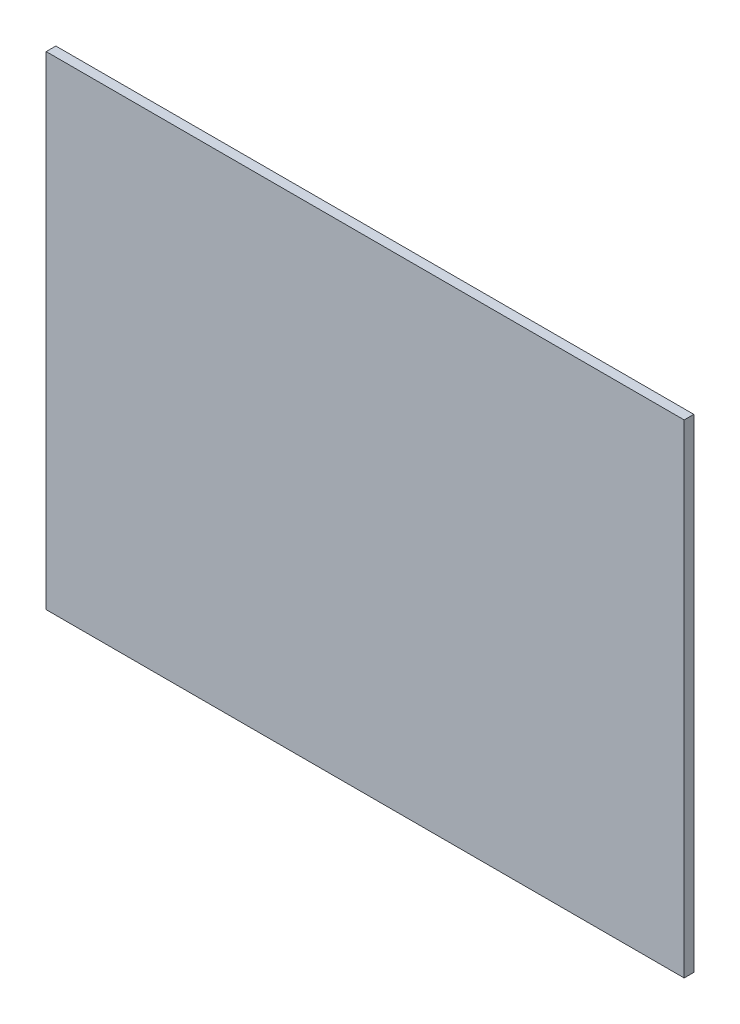
ISO-10303-21;
HEADER;
FILE_DESCRIPTION(('STEP AP214'),'2;1');
FILE_NAME('part.step','',(''),(''),'','','');
FILE_SCHEMA(('AUTOMOTIVE_DESIGN { 1 0 10303 214 1 1 1 1 }'));
ENDSEC;
DATA;
#1=APPLICATION_CONTEXT('core data for automotive mechanical design processes');
#2=APPLICATION_PROTOCOL_DEFINITION('international standard','automotive_design',2000,#1);
#3=PRODUCT_CONTEXT('',#1,'mechanical');
#4=PRODUCT('Part','Part','',(#3));
#5=PRODUCT_RELATED_PRODUCT_CATEGORY('part','',(#4));
#6=PRODUCT_DEFINITION_FORMATION('','',#4);
#7=PRODUCT_DEFINITION_CONTEXT('part definition',#1,'design');
#8=PRODUCT_DEFINITION('design','',#6,#7);
#9=PRODUCT_DEFINITION_SHAPE('','',#8);
#10=(LENGTH_UNIT() NAMED_UNIT(*) SI_UNIT(.MILLI.,.METRE.));
#11=(NAMED_UNIT(*) PLANE_ANGLE_UNIT() SI_UNIT($,.RADIAN.));
#12=(NAMED_UNIT(*) SI_UNIT($,.STERADIAN.) SOLID_ANGLE_UNIT());
#13=UNCERTAINTY_MEASURE_WITH_UNIT(LENGTH_MEASURE(1.E-05),#10,'distance_accuracy_value','');
#14=(GEOMETRIC_REPRESENTATION_CONTEXT(3) GLOBAL_UNCERTAINTY_ASSIGNED_CONTEXT((#13)) GLOBAL_UNIT_ASSIGNED_CONTEXT((#10,
#11,#12)) REPRESENTATION_CONTEXT('',''));
#15=CARTESIAN_POINT('',(0.,0.,0.));
#16=DIRECTION('',(0.,0.,1.));
#17=DIRECTION('',(1.,0.,0.));
#18=AXIS2_PLACEMENT_3D('',#15,#16,#17);
#19=CARTESIAN_POINT('',(-33.,25.,1.));
#20=DIRECTION('',(1.,0.,0.));
#21=DIRECTION('',(0.,1.,0.));
#22=AXIS2_PLACEMENT_3D('',#19,#20,#21);
#23=PLANE('',#22);
#24=DIRECTION('',(0.,-1.,0.));
#25=VECTOR('',#24,1.);
#26=CARTESIAN_POINT('',(-33.,25.,0.));
#27=LINE('',#26,#25);
#28=CARTESIAN_POINT('',(-33.,25.,0.));
#29=VERTEX_POINT('',#28);
#30=CARTESIAN_POINT('',(-33.,-25.,0.));
#31=VERTEX_POINT('',#30);
#32=EDGE_CURVE('E110',#29,#31,#27,.T.);
#33=ORIENTED_EDGE('',*,*,#32,.T.);
#34=DIRECTION('',(0.,0.,-1.));
#35=VECTOR('',#34,1.);
#36=CARTESIAN_POINT('',(-33.,-25.,1.));
#37=LINE('',#36,#35);
#38=CARTESIAN_POINT('',(-33.,-25.,1.));
#39=VERTEX_POINT('',#38);
#40=EDGE_CURVE('E11',#39,#31,#37,.T.);
#41=ORIENTED_EDGE('',*,*,#40,.F.);
#42=DIRECTION('',(0.,-1.,0.));
#43=VECTOR('',#42,1.);
#44=CARTESIAN_POINT('',(-33.,25.,1.));
#45=LINE('',#44,#43);
#46=CARTESIAN_POINT('',(-33.,25.,1.));
#47=VERTEX_POINT('',#46);
#48=EDGE_CURVE('E94',#47,#39,#45,.T.);
#49=ORIENTED_EDGE('',*,*,#48,.F.);
#50=DIRECTION('',(0.,0.,-1.));
#51=VECTOR('',#50,1.);
#52=CARTESIAN_POINT('',(-33.,25.,1.));
#53=LINE('',#52,#51);
#54=EDGE_CURVE('E106',#47,#29,#53,.T.);
#55=ORIENTED_EDGE('',*,*,#54,.T.);
#56=EDGE_LOOP('',(#33,#41,#49,#55));
#57=FACE_BOUND('',#56,.T.);
#58=ADVANCED_FACE('F42',(#57),#23,.F.);
#59=CARTESIAN_POINT('',(-33.,-25.,1.));
#60=DIRECTION('',(0.,1.,0.));
#61=DIRECTION('',(0.,0.,1.));
#62=AXIS2_PLACEMENT_3D('',#59,#60,#61);
#63=PLANE('',#62);
#64=DIRECTION('',(1.,0.,0.));
#65=VECTOR('',#64,1.);
#66=CARTESIAN_POINT('',(-33.,-25.,0.));
#67=LINE('',#66,#65);
#68=CARTESIAN_POINT('',(33.,-25.,0.));
#69=VERTEX_POINT('',#68);
#70=EDGE_CURVE('E99',#31,#69,#67,.T.);
#71=ORIENTED_EDGE('',*,*,#70,.T.);
#72=DIRECTION('',(0.,0.,-1.));
#73=VECTOR('',#72,1.);
#74=CARTESIAN_POINT('',(33.,-25.,1.));
#75=LINE('',#74,#73);
#76=CARTESIAN_POINT('',(33.,-25.,1.));
#77=VERTEX_POINT('',#76);
#78=EDGE_CURVE('E51',#77,#69,#75,.T.);
#79=ORIENTED_EDGE('',*,*,#78,.F.);
#80=DIRECTION('',(1.,0.,0.));
#81=VECTOR('',#80,1.);
#82=CARTESIAN_POINT('',(-33.,-25.,1.));
#83=LINE('',#82,#81);
#84=EDGE_CURVE('E89',#39,#77,#83,.T.);
#85=ORIENTED_EDGE('',*,*,#84,.F.);
#86=ORIENTED_EDGE('',*,*,#40,.T.);
#87=EDGE_LOOP('',(#71,#79,#85,#86));
#88=FACE_BOUND('',#87,.T.);
#89=ADVANCED_FACE('F98',(#88),#63,.F.);
#90=CARTESIAN_POINT('',(33.,25.,1.));
#91=DIRECTION('',(-1.,0.,0.));
#92=DIRECTION('',(0.,-1.,0.));
#93=AXIS2_PLACEMENT_3D('',#90,#91,#92);
#94=PLANE('',#93);
#95=DIRECTION('',(0.,1.,0.));
#96=VECTOR('',#95,1.);
#97=CARTESIAN_POINT('',(33.,25.,0.));
#98=LINE('',#97,#96);
#99=CARTESIAN_POINT('',(33.,25.,0.));
#100=VERTEX_POINT('',#99);
#101=EDGE_CURVE('E76',#69,#100,#98,.T.);
#102=ORIENTED_EDGE('',*,*,#101,.T.);
#103=DIRECTION('',(0.,0.,-1.));
#104=VECTOR('',#103,1.);
#105=CARTESIAN_POINT('',(33.,25.,1.));
#106=LINE('',#105,#104);
#107=CARTESIAN_POINT('',(33.,25.,1.));
#108=VERTEX_POINT('',#107);
#109=EDGE_CURVE('E101',#108,#100,#106,.T.);
#110=ORIENTED_EDGE('',*,*,#109,.F.);
#111=DIRECTION('',(0.,1.,0.));
#112=VECTOR('',#111,1.);
#113=CARTESIAN_POINT('',(33.,25.,1.));
#114=LINE('',#113,#112);
#115=EDGE_CURVE('E92',#77,#108,#114,.T.);
#116=ORIENTED_EDGE('',*,*,#115,.F.);
#117=ORIENTED_EDGE('',*,*,#78,.T.);
#118=EDGE_LOOP('',(#102,#110,#116,#117));
#119=FACE_BOUND('',#118,.T.);
#120=ADVANCED_FACE('F102',(#119),#94,.F.);
#121=CARTESIAN_POINT('',(-33.,25.,1.));
#122=DIRECTION('',(0.,-1.,0.));
#123=DIRECTION('',(0.,0.,-1.));
#124=AXIS2_PLACEMENT_3D('',#121,#122,#123);
#125=PLANE('',#124);
#126=DIRECTION('',(-1.,0.,0.));
#127=VECTOR('',#126,1.);
#128=CARTESIAN_POINT('',(-33.,25.,0.));
#129=LINE('',#128,#127);
#130=EDGE_CURVE('E82',#100,#29,#129,.T.);
#131=ORIENTED_EDGE('',*,*,#130,.T.);
#132=ORIENTED_EDGE('',*,*,#54,.F.);
#133=DIRECTION('',(-1.,0.,0.));
#134=VECTOR('',#133,1.);
#135=CARTESIAN_POINT('',(-33.,25.,1.));
#136=LINE('',#135,#134);
#137=EDGE_CURVE('E59',#108,#47,#136,.T.);
#138=ORIENTED_EDGE('',*,*,#137,.F.);
#139=ORIENTED_EDGE('',*,*,#109,.T.);
#140=EDGE_LOOP('',(#131,#132,#138,#139));
#141=FACE_BOUND('',#140,.T.);
#142=ADVANCED_FACE('F123',(#141),#125,.F.);
#143=CARTESIAN_POINT('',(0.,0.,1.));
#144=DIRECTION('',(0.,0.,1.));
#145=DIRECTION('',(1.,0.,0.));
#146=AXIS2_PLACEMENT_3D('',#143,#144,#145);
#147=PLANE('',#146);
#148=ORIENTED_EDGE('',*,*,#48,.T.);
#149=ORIENTED_EDGE('',*,*,#84,.T.);
#150=ORIENTED_EDGE('',*,*,#115,.T.);
#151=ORIENTED_EDGE('',*,*,#137,.T.);
#152=EDGE_LOOP('',(#148,#149,#150,#151));
#153=FACE_BOUND('',#152,.T.);
#154=ADVANCED_FACE('F90',(#153),#147,.T.);
#155=CARTESIAN_POINT('',(0.,0.,0.));
#156=DIRECTION('',(0.,0.,1.));
#157=DIRECTION('',(1.,0.,0.));
#158=AXIS2_PLACEMENT_3D('',#155,#156,#157);
#159=PLANE('',#158);
#160=ORIENTED_EDGE('',*,*,#32,.F.);
#161=ORIENTED_EDGE('',*,*,#130,.F.);
#162=ORIENTED_EDGE('',*,*,#101,.F.);
#163=ORIENTED_EDGE('',*,*,#70,.F.);
#164=EDGE_LOOP('',(#160,#161,#162,#163));
#165=FACE_BOUND('',#164,.T.);
#166=ADVANCED_FACE('F126',(#165),#159,.F.);
#167=CLOSED_SHELL('',(#58,#89,#120,#142,#154,#166));
#168=MANIFOLD_SOLID_BREP('B2',#167);
#169=ADVANCED_BREP_SHAPE_REPRESENTATION('',(#18,#168),#14);
#170=SHAPE_DEFINITION_REPRESENTATION(#9,#169);
ENDSEC;
END-ISO-10303-21;
